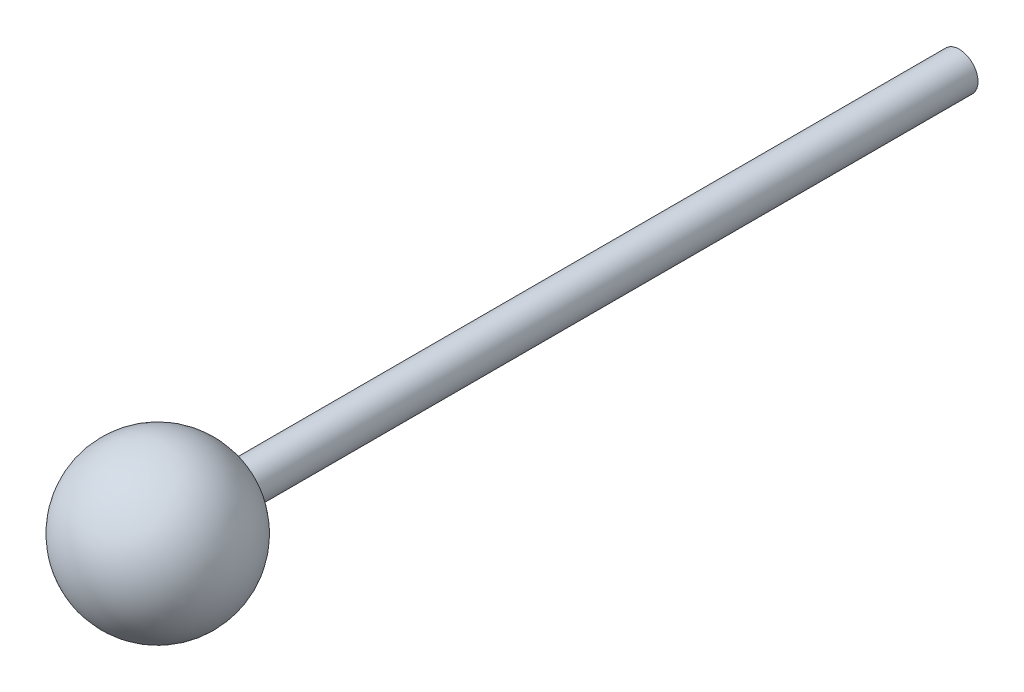
ISO-10303-21;
HEADER;
FILE_DESCRIPTION(('STEP AP214'),'2;1');
FILE_NAME('part.step','',(''),(''),'','','');
FILE_SCHEMA(('AUTOMOTIVE_DESIGN { 1 0 10303 214 1 1 1 1 }'));
ENDSEC;
DATA;
#1=APPLICATION_CONTEXT('core data for automotive mechanical design processes');
#2=APPLICATION_PROTOCOL_DEFINITION('international standard','automotive_design',2000,#1);
#3=PRODUCT_CONTEXT('',#1,'mechanical');
#4=PRODUCT('Part','Part','',(#3));
#5=PRODUCT_RELATED_PRODUCT_CATEGORY('part','',(#4));
#6=PRODUCT_DEFINITION_FORMATION('','',#4);
#7=PRODUCT_DEFINITION_CONTEXT('part definition',#1,'design');
#8=PRODUCT_DEFINITION('design','',#6,#7);
#9=PRODUCT_DEFINITION_SHAPE('','',#8);
#10=(LENGTH_UNIT() NAMED_UNIT(*) SI_UNIT(.MILLI.,.METRE.));
#11=(NAMED_UNIT(*) PLANE_ANGLE_UNIT() SI_UNIT($,.RADIAN.));
#12=(NAMED_UNIT(*) SI_UNIT($,.STERADIAN.) SOLID_ANGLE_UNIT());
#13=UNCERTAINTY_MEASURE_WITH_UNIT(LENGTH_MEASURE(1.E-05),#10,'distance_accuracy_value','');
#14=(GEOMETRIC_REPRESENTATION_CONTEXT(3) GLOBAL_UNCERTAINTY_ASSIGNED_CONTEXT((#13)) GLOBAL_UNIT_ASSIGNED_CONTEXT((#10,
#11,#12)) REPRESENTATION_CONTEXT('',''));
#15=CARTESIAN_POINT('',(0.,0.,0.));
#16=DIRECTION('',(0.,0.,1.));
#17=DIRECTION('',(1.,0.,0.));
#18=AXIS2_PLACEMENT_3D('',#15,#16,#17);
#19=CARTESIAN_POINT('',(0.,0.,25.34));
#20=DIRECTION('',(0.,0.,-1.));
#21=DIRECTION('',(-1.,0.,0.));
#22=AXIS2_PLACEMENT_3D('',#19,#20,#21);
#23=CYLINDRICAL_SURFACE('',#22,0.59375);
#24=CARTESIAN_POINT('',(0.,0.,0.));
#25=DIRECTION('',(0.,0.,1.));
#26=DIRECTION('',(1.,0.,0.));
#27=AXIS2_PLACEMENT_3D('',#24,#25,#26);
#28=CIRCLE('',#27,0.59375);
#29=CARTESIAN_POINT('',(0.59375,0.,0.));
#30=VERTEX_POINT('',#29);
#31=EDGE_CURVE('E48',#30,#30,#28,.T.);
#32=ORIENTED_EDGE('',*,*,#31,.T.);
#33=EDGE_LOOP('',(#32));
#34=FACE_BOUND('',#33,.T.);
#35=CARTESIAN_POINT('',(0.,0.,22.9115311536896));
#36=DIRECTION('',(0.,0.,1.));
#37=DIRECTION('',(1.,0.,0.));
#38=AXIS2_PLACEMENT_3D('',#35,#36,#37);
#39=CIRCLE('',#38,0.59375);
#40=CARTESIAN_POINT('',(0.59375,0.,22.9115311536896));
#41=VERTEX_POINT('',#40);
#42=EDGE_CURVE('E10',#41,#41,#39,.T.);
#43=ORIENTED_EDGE('',*,*,#42,.F.);
#44=EDGE_LOOP('',(#43));
#45=FACE_BOUND('',#44,.T.);
#46=ADVANCED_FACE('F40',(#34,#45),#23,.T.);
#47=CARTESIAN_POINT('',(0.,0.,0.));
#48=DIRECTION('',(0.,0.,1.));
#49=DIRECTION('',(1.,0.,0.));
#50=AXIS2_PLACEMENT_3D('',#47,#48,#49);
#51=PLANE('',#50);
#52=ORIENTED_EDGE('',*,*,#31,.F.);
#53=EDGE_LOOP('',(#52));
#54=FACE_BOUND('',#53,.T.);
#55=ADVANCED_FACE('F74',(#54),#51,.F.);
#56=CARTESIAN_POINT('',(0.,0.,25.34));
#57=DIRECTION('',(0.,-1.,0.));
#58=DIRECTION('',(-1.,0.,0.));
#59=AXIS2_PLACEMENT_3D('',#56,#57,#58);
#60=SPHERICAL_SURFACE('',#59,2.5);
#61=CARTESIAN_POINT('',(0.,0.,25.34));
#62=DIRECTION('',(0.,0.,1.));
#63=DIRECTION('',(1.,0.,0.));
#64=AXIS2_PLACEMENT_3D('',#61,#62,#63);
#65=SPHERICAL_SURFACE('',#64,2.5);
#66=ORIENTED_EDGE('',*,*,#42,.T.);
#67=EDGE_LOOP('',(#66));
#68=FACE_BOUND('',#67,.T.);
#69=ADVANCED_FACE('F73',(#68),#65,.T.);
#70=CLOSED_SHELL('',(#46,#55,#69));
#71=CARTESIAN_POINT('',(0.,0.,25.34));
#72=DIRECTION('',(0.,-1.,0.));
#73=DIRECTION('',(-1.,0.,0.));
#74=AXIS2_PLACEMENT_3D('',#71,#72,#73);
#75=SPHERICAL_SURFACE('',#74,0.59375);
#76=CARTESIAN_POINT('',(0.,0.,25.34));
#77=DIRECTION('',(0.,0.,1.));
#78=DIRECTION('',(1.,0.,0.));
#79=AXIS2_PLACEMENT_3D('',#76,#77,#78);
#80=SPHERICAL_SURFACE('',#79,0.59375);
#81=CARTESIAN_POINT('',(0.,0.,25.34));
#82=DIRECTION('',(0.,0.,1.));
#83=DIRECTION('',(1.,0.,0.));
#84=AXIS2_PLACEMENT_3D('',#81,#82,#83);
#85=CIRCLE('',#84,0.59375);
#86=CARTESIAN_POINT('',(0.59375,0.,25.34));
#87=VERTEX_POINT('',#86);
#88=EDGE_CURVE('E53',#87,#87,#85,.F.);
#89=ORIENTED_EDGE('',*,*,#88,.T.);
#90=EDGE_LOOP('',(#89));
#91=FACE_BOUND('',#90,.T.);
#92=ADVANCED_FACE('F61',(#91),#80,.F.);
#93=CARTESIAN_POINT('',(0.,0.,25.34));
#94=DIRECTION('',(0.,0.,1.));
#95=DIRECTION('',(1.,0.,0.));
#96=AXIS2_PLACEMENT_3D('',#93,#94,#95);
#97=PLANE('',#96);
#98=ORIENTED_EDGE('',*,*,#88,.F.);
#99=EDGE_LOOP('',(#98));
#100=FACE_BOUND('',#99,.T.);
#101=ADVANCED_FACE('F63',(#100),#97,.T.);
#102=CLOSED_SHELL('',(#92,#101));
#103=ORIENTED_CLOSED_SHELL('',*,#102,.T.);
#104=BREP_WITH_VOIDS('B2',#70,(#103));
#105=ADVANCED_BREP_SHAPE_REPRESENTATION('',(#18,#104),#14);
#106=SHAPE_DEFINITION_REPRESENTATION(#9,#105);
ENDSEC;
END-ISO-10303-21;
